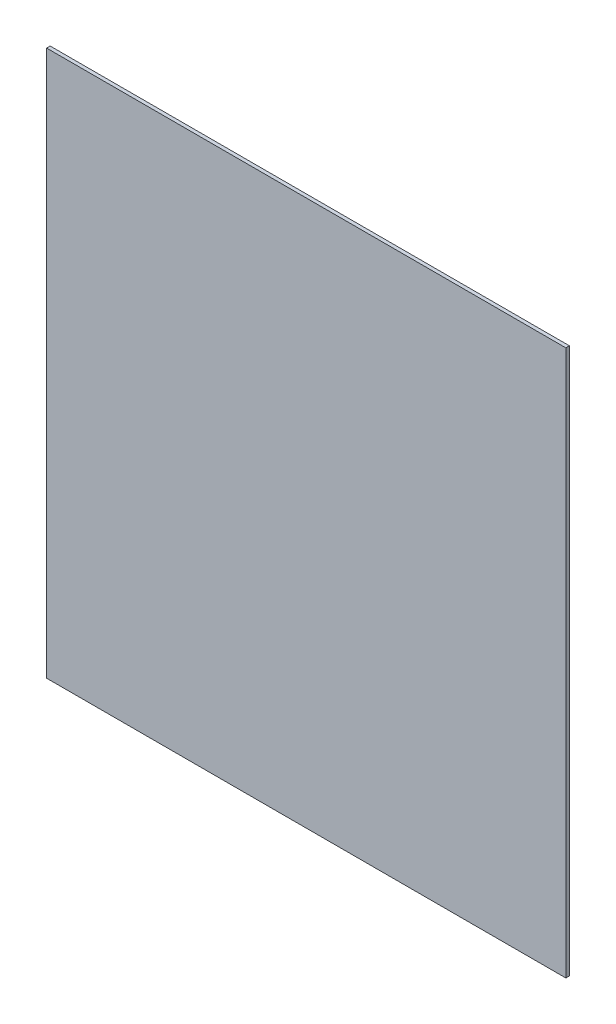
ISO-10303-21;
HEADER;
FILE_DESCRIPTION(('STEP AP214'),'2;1');
FILE_NAME('part.step','',(''),(''),'','','');
FILE_SCHEMA(('AUTOMOTIVE_DESIGN { 1 0 10303 214 1 1 1 1 }'));
ENDSEC;
DATA;
#1=APPLICATION_CONTEXT('core data for automotive mechanical design processes');
#2=APPLICATION_PROTOCOL_DEFINITION('international standard','automotive_design',2000,#1);
#3=PRODUCT_CONTEXT('',#1,'mechanical');
#4=PRODUCT('Part','Part','',(#3));
#5=PRODUCT_RELATED_PRODUCT_CATEGORY('part','',(#4));
#6=PRODUCT_DEFINITION_FORMATION('','',#4);
#7=PRODUCT_DEFINITION_CONTEXT('part definition',#1,'design');
#8=PRODUCT_DEFINITION('design','',#6,#7);
#9=PRODUCT_DEFINITION_SHAPE('','',#8);
#10=(LENGTH_UNIT() NAMED_UNIT(*) SI_UNIT(.MILLI.,.METRE.));
#11=(NAMED_UNIT(*) PLANE_ANGLE_UNIT() SI_UNIT($,.RADIAN.));
#12=(NAMED_UNIT(*) SI_UNIT($,.STERADIAN.) SOLID_ANGLE_UNIT());
#13=UNCERTAINTY_MEASURE_WITH_UNIT(LENGTH_MEASURE(1.E-05),#10,'distance_accuracy_value','');
#14=(GEOMETRIC_REPRESENTATION_CONTEXT(3) GLOBAL_UNCERTAINTY_ASSIGNED_CONTEXT((#13)) GLOBAL_UNIT_ASSIGNED_CONTEXT((#10,
#11,#12)) REPRESENTATION_CONTEXT('',''));
#15=CARTESIAN_POINT('',(0.,0.,0.));
#16=DIRECTION('',(0.,0.,1.));
#17=DIRECTION('',(1.,0.,0.));
#18=AXIS2_PLACEMENT_3D('',#15,#16,#17);
#19=CARTESIAN_POINT('',(0.,0.,3.));
#20=DIRECTION('',(1.,0.,0.));
#21=DIRECTION('',(0.,0.,-1.));
#22=AXIS2_PLACEMENT_3D('',#19,#20,#21);
#23=PLANE('',#22);
#24=DIRECTION('',(0.,-1.,0.));
#25=VECTOR('',#24,1.);
#26=CARTESIAN_POINT('',(0.,0.,0.));
#27=LINE('',#26,#25);
#28=CARTESIAN_POINT('',(0.,460.,0.));
#29=VERTEX_POINT('',#28);
#30=CARTESIAN_POINT('',(0.,0.,0.));
#31=VERTEX_POINT('',#30);
#32=EDGE_CURVE('E111',#29,#31,#27,.T.);
#33=ORIENTED_EDGE('',*,*,#32,.T.);
#34=DIRECTION('',(0.,0.,-1.));
#35=VECTOR('',#34,1.);
#36=CARTESIAN_POINT('',(0.,0.,3.));
#37=LINE('',#36,#35);
#38=CARTESIAN_POINT('',(0.,0.,3.));
#39=VERTEX_POINT('',#38);
#40=EDGE_CURVE('E11',#39,#31,#37,.T.);
#41=ORIENTED_EDGE('',*,*,#40,.F.);
#42=DIRECTION('',(0.,-1.,0.));
#43=VECTOR('',#42,1.);
#44=CARTESIAN_POINT('',(0.,0.,3.));
#45=LINE('',#44,#43);
#46=CARTESIAN_POINT('',(0.,460.,3.));
#47=VERTEX_POINT('',#46);
#48=EDGE_CURVE('E95',#47,#39,#45,.T.);
#49=ORIENTED_EDGE('',*,*,#48,.F.);
#50=DIRECTION('',(0.,0.,-1.));
#51=VECTOR('',#50,1.);
#52=CARTESIAN_POINT('',(0.,460.,3.));
#53=LINE('',#52,#51);
#54=EDGE_CURVE('E107',#47,#29,#53,.T.);
#55=ORIENTED_EDGE('',*,*,#54,.T.);
#56=EDGE_LOOP('',(#33,#41,#49,#55));
#57=FACE_BOUND('',#56,.T.);
#58=ADVANCED_FACE('F43',(#57),#23,.F.);
#59=CARTESIAN_POINT('',(0.,0.,3.));
#60=DIRECTION('',(0.,1.,0.));
#61=DIRECTION('',(0.,0.,1.));
#62=AXIS2_PLACEMENT_3D('',#59,#60,#61);
#63=PLANE('',#62);
#64=DIRECTION('',(1.,0.,0.));
#65=VECTOR('',#64,1.);
#66=CARTESIAN_POINT('',(0.,0.,0.));
#67=LINE('',#66,#65);
#68=CARTESIAN_POINT('',(437.65,0.,0.));
#69=VERTEX_POINT('',#68);
#70=EDGE_CURVE('E100',#31,#69,#67,.T.);
#71=ORIENTED_EDGE('',*,*,#70,.T.);
#72=DIRECTION('',(0.,0.,-1.));
#73=VECTOR('',#72,1.);
#74=CARTESIAN_POINT('',(437.65,0.,3.));
#75=LINE('',#74,#73);
#76=CARTESIAN_POINT('',(437.65,0.,3.));
#77=VERTEX_POINT('',#76);
#78=EDGE_CURVE('E52',#77,#69,#75,.T.);
#79=ORIENTED_EDGE('',*,*,#78,.F.);
#80=DIRECTION('',(1.,0.,0.));
#81=VECTOR('',#80,1.);
#82=CARTESIAN_POINT('',(0.,0.,3.));
#83=LINE('',#82,#81);
#84=EDGE_CURVE('E90',#39,#77,#83,.T.);
#85=ORIENTED_EDGE('',*,*,#84,.F.);
#86=ORIENTED_EDGE('',*,*,#40,.T.);
#87=EDGE_LOOP('',(#71,#79,#85,#86));
#88=FACE_BOUND('',#87,.T.);
#89=ADVANCED_FACE('F99',(#88),#63,.F.);
#90=CARTESIAN_POINT('',(437.65,0.,3.));
#91=DIRECTION('',(-1.,0.,0.));
#92=DIRECTION('',(0.,0.,1.));
#93=AXIS2_PLACEMENT_3D('',#90,#91,#92);
#94=PLANE('',#93);
#95=DIRECTION('',(0.,1.,0.));
#96=VECTOR('',#95,1.);
#97=CARTESIAN_POINT('',(437.65,0.,0.));
#98=LINE('',#97,#96);
#99=CARTESIAN_POINT('',(437.65,460.,0.));
#100=VERTEX_POINT('',#99);
#101=EDGE_CURVE('E77',#69,#100,#98,.T.);
#102=ORIENTED_EDGE('',*,*,#101,.T.);
#103=DIRECTION('',(0.,0.,-1.));
#104=VECTOR('',#103,1.);
#105=CARTESIAN_POINT('',(437.65,460.,3.));
#106=LINE('',#105,#104);
#107=CARTESIAN_POINT('',(437.65,460.,3.));
#108=VERTEX_POINT('',#107);
#109=EDGE_CURVE('E102',#108,#100,#106,.T.);
#110=ORIENTED_EDGE('',*,*,#109,.F.);
#111=DIRECTION('',(0.,1.,0.));
#112=VECTOR('',#111,1.);
#113=CARTESIAN_POINT('',(437.65,0.,3.));
#114=LINE('',#113,#112);
#115=EDGE_CURVE('E93',#77,#108,#114,.T.);
#116=ORIENTED_EDGE('',*,*,#115,.F.);
#117=ORIENTED_EDGE('',*,*,#78,.T.);
#118=EDGE_LOOP('',(#102,#110,#116,#117));
#119=FACE_BOUND('',#118,.T.);
#120=ADVANCED_FACE('F103',(#119),#94,.F.);
#121=CARTESIAN_POINT('',(0.,460.,3.));
#122=DIRECTION('',(0.,-1.,0.));
#123=DIRECTION('',(0.,0.,-1.));
#124=AXIS2_PLACEMENT_3D('',#121,#122,#123);
#125=PLANE('',#124);
#126=DIRECTION('',(-1.,0.,0.));
#127=VECTOR('',#126,1.);
#128=CARTESIAN_POINT('',(0.,460.,0.));
#129=LINE('',#128,#127);
#130=EDGE_CURVE('E83',#100,#29,#129,.T.);
#131=ORIENTED_EDGE('',*,*,#130,.T.);
#132=ORIENTED_EDGE('',*,*,#54,.F.);
#133=DIRECTION('',(-1.,0.,0.));
#134=VECTOR('',#133,1.);
#135=CARTESIAN_POINT('',(0.,460.,3.));
#136=LINE('',#135,#134);
#137=EDGE_CURVE('E60',#108,#47,#136,.T.);
#138=ORIENTED_EDGE('',*,*,#137,.F.);
#139=ORIENTED_EDGE('',*,*,#109,.T.);
#140=EDGE_LOOP('',(#131,#132,#138,#139));
#141=FACE_BOUND('',#140,.T.);
#142=ADVANCED_FACE('F124',(#141),#125,.F.);
#143=CARTESIAN_POINT('',(0.,0.,3.));
#144=DIRECTION('',(0.,0.,-1.));
#145=DIRECTION('',(-1.,0.,0.));
#146=AXIS2_PLACEMENT_3D('',#143,#144,#145);
#147=PLANE('',#146);
#148=ORIENTED_EDGE('',*,*,#48,.T.);
#149=ORIENTED_EDGE('',*,*,#84,.T.);
#150=ORIENTED_EDGE('',*,*,#115,.T.);
#151=ORIENTED_EDGE('',*,*,#137,.T.);
#152=EDGE_LOOP('',(#148,#149,#150,#151));
#153=FACE_BOUND('',#152,.T.);
#154=ADVANCED_FACE('F91',(#153),#147,.F.);
#155=CARTESIAN_POINT('',(0.,0.,0.));
#156=DIRECTION('',(0.,0.,-1.));
#157=DIRECTION('',(-1.,0.,0.));
#158=AXIS2_PLACEMENT_3D('',#155,#156,#157);
#159=PLANE('',#158);
#160=ORIENTED_EDGE('',*,*,#32,.F.);
#161=ORIENTED_EDGE('',*,*,#130,.F.);
#162=ORIENTED_EDGE('',*,*,#101,.F.);
#163=ORIENTED_EDGE('',*,*,#70,.F.);
#164=EDGE_LOOP('',(#160,#161,#162,#163));
#165=FACE_BOUND('',#164,.T.);
#166=ADVANCED_FACE('F127',(#165),#159,.T.);
#167=CLOSED_SHELL('',(#58,#89,#120,#142,#154,#166));
#168=MANIFOLD_SOLID_BREP('B2',#167);
#169=ADVANCED_BREP_SHAPE_REPRESENTATION('',(#18,#168),#14);
#170=SHAPE_DEFINITION_REPRESENTATION(#9,#169);
ENDSEC;
END-ISO-10303-21;
